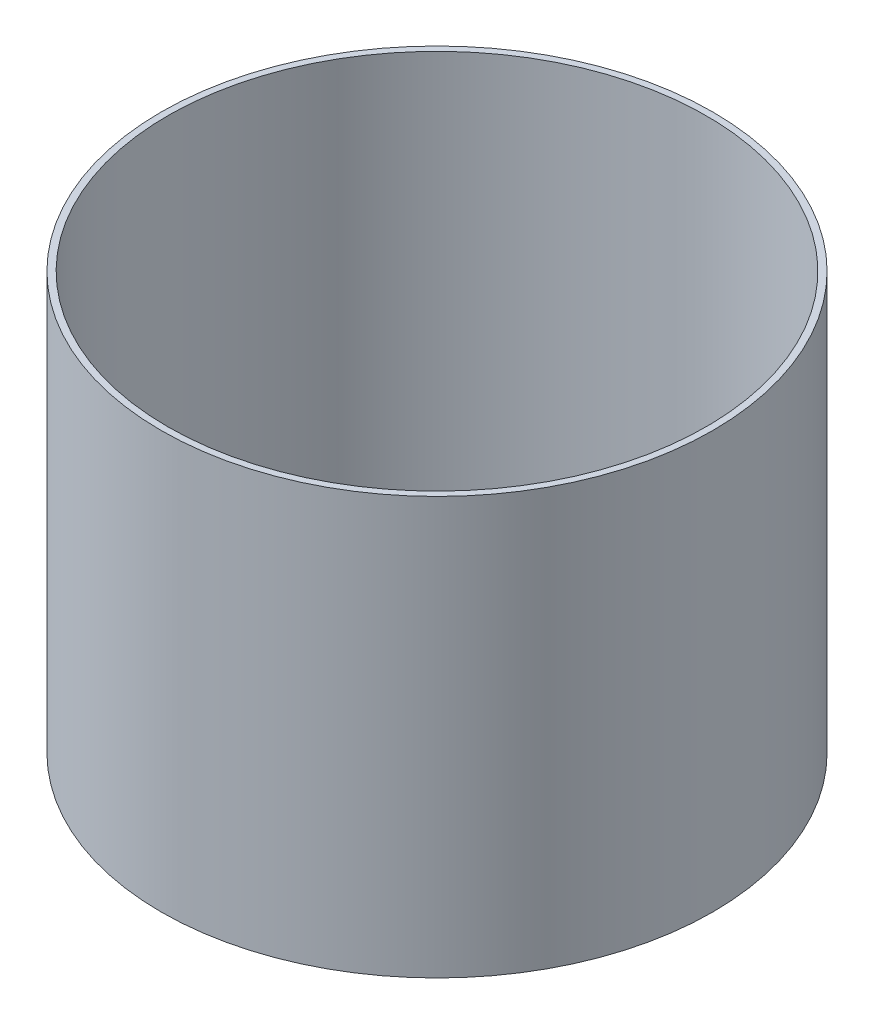
ISO-10303-21;
HEADER;
FILE_DESCRIPTION(('STEP AP214'),'2;1');
FILE_NAME('part.step','',(''),(''),'','','');
FILE_SCHEMA(('AUTOMOTIVE_DESIGN { 1 0 10303 214 1 1 1 1 }'));
ENDSEC;
DATA;
#1=APPLICATION_CONTEXT('core data for automotive mechanical design processes');
#2=APPLICATION_PROTOCOL_DEFINITION('international standard','automotive_design',2000,#1);
#3=PRODUCT_CONTEXT('',#1,'mechanical');
#4=PRODUCT('Part','Part','',(#3));
#5=PRODUCT_RELATED_PRODUCT_CATEGORY('part','',(#4));
#6=PRODUCT_DEFINITION_FORMATION('','',#4);
#7=PRODUCT_DEFINITION_CONTEXT('part definition',#1,'design');
#8=PRODUCT_DEFINITION('design','',#6,#7);
#9=PRODUCT_DEFINITION_SHAPE('','',#8);
#10=(LENGTH_UNIT() NAMED_UNIT(*) SI_UNIT(.MILLI.,.METRE.));
#11=(NAMED_UNIT(*) PLANE_ANGLE_UNIT() SI_UNIT($,.RADIAN.));
#12=(NAMED_UNIT(*) SI_UNIT($,.STERADIAN.) SOLID_ANGLE_UNIT());
#13=UNCERTAINTY_MEASURE_WITH_UNIT(LENGTH_MEASURE(1.E-05),#10,'distance_accuracy_value','');
#14=(GEOMETRIC_REPRESENTATION_CONTEXT(3) GLOBAL_UNCERTAINTY_ASSIGNED_CONTEXT((#13)) GLOBAL_UNIT_ASSIGNED_CONTEXT((#10,
#11,#12)) REPRESENTATION_CONTEXT('',''));
#15=CARTESIAN_POINT('',(0.,0.,0.));
#16=DIRECTION('',(0.,0.,1.));
#17=DIRECTION('',(1.,0.,0.));
#18=AXIS2_PLACEMENT_3D('',#15,#16,#17);
#19=CARTESIAN_POINT('',(0.,12.,0.));
#20=DIRECTION('',(0.,1.,0.));
#21=DIRECTION('',(0.,0.,1.));
#22=AXIS2_PLACEMENT_3D('',#19,#20,#21);
#23=PLANE('',#22);
#24=CARTESIAN_POINT('',(0.,12.,0.));
#25=DIRECTION('',(0.,1.,0.));
#26=DIRECTION('',(0.,0.,1.));
#27=AXIS2_PLACEMENT_3D('',#24,#25,#26);
#28=CIRCLE('',#27,7.9375);
#29=CARTESIAN_POINT('',(0.,12.,7.9375));
#30=VERTEX_POINT('',#29);
#31=EDGE_CURVE('E10',#30,#30,#28,.T.);
#32=ORIENTED_EDGE('',*,*,#31,.T.);
#33=EDGE_LOOP('',(#32));
#34=FACE_BOUND('',#33,.T.);
#35=CARTESIAN_POINT('',(0.,12.,0.));
#36=DIRECTION('',(0.,1.,0.));
#37=DIRECTION('',(0.,0.,1.));
#38=AXIS2_PLACEMENT_3D('',#35,#36,#37);
#39=CIRCLE('',#38,7.75);
#40=CARTESIAN_POINT('',(0.,12.,7.75));
#41=VERTEX_POINT('',#40);
#42=EDGE_CURVE('E46',#41,#41,#39,.T.);
#43=ORIENTED_EDGE('',*,*,#42,.F.);
#44=EDGE_LOOP('',(#43));
#45=FACE_BOUND('',#44,.T.);
#46=ADVANCED_FACE('F35',(#34,#45),#23,.T.);
#47=CARTESIAN_POINT('',(0.,0.,0.));
#48=DIRECTION('',(0.,1.,0.));
#49=DIRECTION('',(0.,0.,1.));
#50=AXIS2_PLACEMENT_3D('',#47,#48,#49);
#51=PLANE('',#50);
#52=CARTESIAN_POINT('',(0.,0.,0.));
#53=DIRECTION('',(0.,1.,0.));
#54=DIRECTION('',(0.,0.,1.));
#55=AXIS2_PLACEMENT_3D('',#52,#53,#54);
#56=CIRCLE('',#55,7.9375);
#57=CARTESIAN_POINT('',(0.,0.,7.9375));
#58=VERTEX_POINT('',#57);
#59=EDGE_CURVE('E39',#58,#58,#56,.T.);
#60=ORIENTED_EDGE('',*,*,#59,.F.);
#61=EDGE_LOOP('',(#60));
#62=FACE_BOUND('',#61,.T.);
#63=CARTESIAN_POINT('',(0.,0.,0.));
#64=DIRECTION('',(0.,1.,0.));
#65=DIRECTION('',(0.,0.,1.));
#66=AXIS2_PLACEMENT_3D('',#63,#64,#65);
#67=CIRCLE('',#66,7.75);
#68=CARTESIAN_POINT('',(0.,0.,7.75));
#69=VERTEX_POINT('',#68);
#70=EDGE_CURVE('E48',#69,#69,#67,.T.);
#71=ORIENTED_EDGE('',*,*,#70,.T.);
#72=EDGE_LOOP('',(#71));
#73=FACE_BOUND('',#72,.T.);
#74=ADVANCED_FACE('F58',(#62,#73),#51,.F.);
#75=CARTESIAN_POINT('',(0.,12.,0.));
#76=DIRECTION('',(0.,-1.,0.));
#77=DIRECTION('',(0.,0.,-1.));
#78=AXIS2_PLACEMENT_3D('',#75,#76,#77);
#79=CYLINDRICAL_SURFACE('',#78,7.9375);
#80=ORIENTED_EDGE('',*,*,#31,.F.);
#81=EDGE_LOOP('',(#80));
#82=FACE_BOUND('',#81,.T.);
#83=ORIENTED_EDGE('',*,*,#59,.T.);
#84=EDGE_LOOP('',(#83));
#85=FACE_BOUND('',#84,.T.);
#86=ADVANCED_FACE('F37',(#82,#85),#79,.T.);
#87=CARTESIAN_POINT('',(0.,12.,0.));
#88=DIRECTION('',(0.,-1.,0.));
#89=DIRECTION('',(0.,0.,-1.));
#90=AXIS2_PLACEMENT_3D('',#87,#88,#89);
#91=CYLINDRICAL_SURFACE('',#90,7.75);
#92=ORIENTED_EDGE('',*,*,#42,.T.);
#93=EDGE_LOOP('',(#92));
#94=FACE_BOUND('',#93,.T.);
#95=ORIENTED_EDGE('',*,*,#70,.F.);
#96=EDGE_LOOP('',(#95));
#97=FACE_BOUND('',#96,.T.);
#98=ADVANCED_FACE('F54',(#94,#97),#91,.F.);
#99=CLOSED_SHELL('',(#46,#74,#86,#98));
#100=MANIFOLD_SOLID_BREP('B2',#99);
#101=ADVANCED_BREP_SHAPE_REPRESENTATION('',(#18,#100),#14);
#102=SHAPE_DEFINITION_REPRESENTATION(#9,#101);
ENDSEC;
END-ISO-10303-21;
